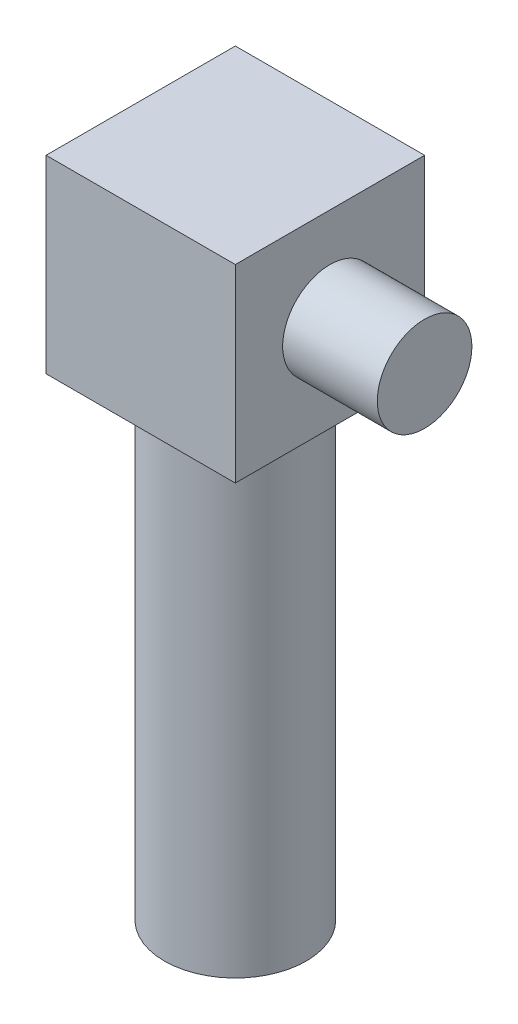
ISO-10303-21;
HEADER;
FILE_DESCRIPTION(('STEP AP214'),'2;1');
FILE_NAME('part.step','',(''),(''),'','','');
FILE_SCHEMA(('AUTOMOTIVE_DESIGN { 1 0 10303 214 1 1 1 1 }'));
ENDSEC;
DATA;
#1=APPLICATION_CONTEXT('core data for automotive mechanical design processes');
#2=APPLICATION_PROTOCOL_DEFINITION('international standard','automotive_design',2000,#1);
#3=PRODUCT_CONTEXT('',#1,'mechanical');
#4=PRODUCT('Part','Part','',(#3));
#5=PRODUCT_RELATED_PRODUCT_CATEGORY('part','',(#4));
#6=PRODUCT_DEFINITION_FORMATION('','',#4);
#7=PRODUCT_DEFINITION_CONTEXT('part definition',#1,'design');
#8=PRODUCT_DEFINITION('design','',#6,#7);
#9=PRODUCT_DEFINITION_SHAPE('','',#8);
#10=(LENGTH_UNIT() NAMED_UNIT(*) SI_UNIT(.MILLI.,.METRE.));
#11=(NAMED_UNIT(*) PLANE_ANGLE_UNIT() SI_UNIT($,.RADIAN.));
#12=(NAMED_UNIT(*) SI_UNIT($,.STERADIAN.) SOLID_ANGLE_UNIT());
#13=UNCERTAINTY_MEASURE_WITH_UNIT(LENGTH_MEASURE(1.E-05),#10,'distance_accuracy_value','');
#14=(GEOMETRIC_REPRESENTATION_CONTEXT(3) GLOBAL_UNCERTAINTY_ASSIGNED_CONTEXT((#13)) GLOBAL_UNIT_ASSIGNED_CONTEXT((#10,
#11,#12)) REPRESENTATION_CONTEXT('',''));
#15=CARTESIAN_POINT('',(0.,0.,0.));
#16=DIRECTION('',(0.,0.,1.));
#17=DIRECTION('',(1.,0.,0.));
#18=AXIS2_PLACEMENT_3D('',#15,#16,#17);
#19=CARTESIAN_POINT('',(0.,50.,0.));
#20=DIRECTION('',(0.,-1.,0.));
#21=DIRECTION('',(0.,0.,-1.));
#22=AXIS2_PLACEMENT_3D('',#19,#20,#21);
#23=CYLINDRICAL_SURFACE('',#22,5.);
#24=CARTESIAN_POINT('',(0.,50.,0.));
#25=DIRECTION('',(0.,1.,0.));
#26=DIRECTION('',(0.,0.,1.));
#27=AXIS2_PLACEMENT_3D('',#24,#25,#26);
#28=CIRCLE('',#27,5.);
#29=CARTESIAN_POINT('',(0.,50.,5.));
#30=VERTEX_POINT('',#29);
#31=EDGE_CURVE('E134',#30,#30,#28,.T.);
#32=ORIENTED_EDGE('',*,*,#31,.T.);
#33=EDGE_LOOP('',(#32));
#34=FACE_BOUND('',#33,.T.);
#35=CARTESIAN_POINT('',(0.,0.,0.));
#36=DIRECTION('',(0.,1.,0.));
#37=DIRECTION('',(0.,0.,1.));
#38=AXIS2_PLACEMENT_3D('',#35,#36,#37);
#39=CIRCLE('',#38,5.);
#40=CARTESIAN_POINT('',(0.,0.,5.));
#41=VERTEX_POINT('',#40);
#42=EDGE_CURVE('E137',#41,#41,#39,.T.);
#43=ORIENTED_EDGE('',*,*,#42,.F.);
#44=EDGE_LOOP('',(#43));
#45=FACE_BOUND('',#44,.T.);
#46=ADVANCED_FACE('F55',(#34,#45),#23,.F.);
#47=CARTESIAN_POINT('',(0.,50.,0.));
#48=DIRECTION('',(0.,-1.,0.));
#49=DIRECTION('',(0.,0.,-1.));
#50=AXIS2_PLACEMENT_3D('',#47,#48,#49);
#51=CYLINDRICAL_SURFACE('',#50,7.5);
#52=CARTESIAN_POINT('',(0.,50.,0.));
#53=DIRECTION('',(0.,1.,0.));
#54=DIRECTION('',(0.,0.,1.));
#55=AXIS2_PLACEMENT_3D('',#52,#53,#54);
#56=CIRCLE('',#55,7.5);
#57=CARTESIAN_POINT('',(0.,50.,7.5));
#58=VERTEX_POINT('',#57);
#59=EDGE_CURVE('E62',#58,#58,#56,.T.);
#60=ORIENTED_EDGE('',*,*,#59,.F.);
#61=EDGE_LOOP('',(#60));
#62=FACE_BOUND('',#61,.T.);
#63=CARTESIAN_POINT('',(0.,0.,0.));
#64=DIRECTION('',(0.,1.,0.));
#65=DIRECTION('',(0.,0.,1.));
#66=AXIS2_PLACEMENT_3D('',#63,#64,#65);
#67=CIRCLE('',#66,7.5);
#68=CARTESIAN_POINT('',(0.,0.,7.5));
#69=VERTEX_POINT('',#68);
#70=EDGE_CURVE('E54',#69,#69,#67,.T.);
#71=ORIENTED_EDGE('',*,*,#70,.T.);
#72=EDGE_LOOP('',(#71));
#73=FACE_BOUND('',#72,.T.);
#74=ADVANCED_FACE('F145',(#62,#73),#51,.T.);
#75=CARTESIAN_POINT('',(0.,0.,0.));
#76=DIRECTION('',(0.,1.,0.));
#77=DIRECTION('',(0.,0.,1.));
#78=AXIS2_PLACEMENT_3D('',#75,#76,#77);
#79=PLANE('',#78);
#80=ORIENTED_EDGE('',*,*,#42,.T.);
#81=EDGE_LOOP('',(#80));
#82=FACE_BOUND('',#81,.T.);
#83=ORIENTED_EDGE('',*,*,#70,.F.);
#84=EDGE_LOOP('',(#83));
#85=FACE_BOUND('',#84,.T.);
#86=ADVANCED_FACE('F148',(#82,#85),#79,.F.);
#87=CARTESIAN_POINT('',(0.,50.,0.));
#88=DIRECTION('',(0.,1.,0.));
#89=DIRECTION('',(0.,0.,1.));
#90=AXIS2_PLACEMENT_3D('',#87,#88,#89);
#91=PLANE('',#90);
#92=ORIENTED_EDGE('',*,*,#59,.T.);
#93=EDGE_LOOP('',(#92));
#94=FACE_BOUND('',#93,.T.);
#95=DIRECTION('',(1.,0.,0.));
#96=VECTOR('',#95,1.);
#97=CARTESIAN_POINT('',(0.,50.,10.));
#98=LINE('',#97,#96);
#99=CARTESIAN_POINT('',(-10.,50.,10.));
#100=VERTEX_POINT('',#99);
#101=CARTESIAN_POINT('',(10.,50.,10.));
#102=VERTEX_POINT('',#101);
#103=EDGE_CURVE('E122',#100,#102,#98,.T.);
#104=ORIENTED_EDGE('',*,*,#103,.F.);
#105=DIRECTION('',(0.,0.,-1.));
#106=VECTOR('',#105,1.);
#107=CARTESIAN_POINT('',(-10.,50.,0.));
#108=LINE('',#107,#106);
#109=CARTESIAN_POINT('',(-10.,50.,-10.));
#110=VERTEX_POINT('',#109);
#111=EDGE_CURVE('E130',#100,#110,#108,.T.);
#112=ORIENTED_EDGE('',*,*,#111,.T.);
#113=DIRECTION('',(1.,0.,0.));
#114=VECTOR('',#113,1.);
#115=CARTESIAN_POINT('',(0.,50.,-10.));
#116=LINE('',#115,#114);
#117=CARTESIAN_POINT('',(10.,50.,-10.));
#118=VERTEX_POINT('',#117);
#119=EDGE_CURVE('E123',#110,#118,#116,.T.);
#120=ORIENTED_EDGE('',*,*,#119,.T.);
#121=DIRECTION('',(0.,0.,-1.));
#122=VECTOR('',#121,1.);
#123=CARTESIAN_POINT('',(10.,50.,0.));
#124=LINE('',#123,#122);
#125=EDGE_CURVE('E109',#102,#118,#124,.T.);
#126=ORIENTED_EDGE('',*,*,#125,.F.);
#127=EDGE_LOOP('',(#104,#112,#120,#126));
#128=FACE_BOUND('',#127,.T.);
#129=ADVANCED_FACE('F146',(#94,#128),#91,.F.);
#130=CARTESIAN_POINT('',(0.,70.,0.));
#131=DIRECTION('',(0.,1.,0.));
#132=DIRECTION('',(0.,0.,1.));
#133=AXIS2_PLACEMENT_3D('',#130,#131,#132);
#134=PLANE('',#133);
#135=DIRECTION('',(1.,0.,0.));
#136=VECTOR('',#135,1.);
#137=CARTESIAN_POINT('',(0.,70.,10.));
#138=LINE('',#137,#136);
#139=CARTESIAN_POINT('',(-10.,70.,10.));
#140=VERTEX_POINT('',#139);
#141=CARTESIAN_POINT('',(10.,70.,10.));
#142=VERTEX_POINT('',#141);
#143=EDGE_CURVE('E102',#140,#142,#138,.T.);
#144=ORIENTED_EDGE('',*,*,#143,.T.);
#145=DIRECTION('',(0.,0.,-1.));
#146=VECTOR('',#145,1.);
#147=CARTESIAN_POINT('',(10.,70.,0.));
#148=LINE('',#147,#146);
#149=CARTESIAN_POINT('',(10.,70.,-10.));
#150=VERTEX_POINT('',#149);
#151=EDGE_CURVE('E96',#142,#150,#148,.T.);
#152=ORIENTED_EDGE('',*,*,#151,.T.);
#153=DIRECTION('',(1.,0.,0.));
#154=VECTOR('',#153,1.);
#155=CARTESIAN_POINT('',(0.,70.,-10.));
#156=LINE('',#155,#154);
#157=CARTESIAN_POINT('',(-10.,70.,-10.));
#158=VERTEX_POINT('',#157);
#159=EDGE_CURVE('E103',#158,#150,#156,.T.);
#160=ORIENTED_EDGE('',*,*,#159,.F.);
#161=DIRECTION('',(0.,0.,-1.));
#162=VECTOR('',#161,1.);
#163=CARTESIAN_POINT('',(-10.,70.,0.));
#164=LINE('',#163,#162);
#165=EDGE_CURVE('E117',#140,#158,#164,.T.);
#166=ORIENTED_EDGE('',*,*,#165,.F.);
#167=EDGE_LOOP('',(#144,#152,#160,#166));
#168=FACE_BOUND('',#167,.T.);
#169=ADVANCED_FACE('F99',(#168),#134,.T.);
#170=CARTESIAN_POINT('',(-10.,70.,0.));
#171=DIRECTION('',(-1.,0.,0.));
#172=DIRECTION('',(0.,0.,1.));
#173=AXIS2_PLACEMENT_3D('',#170,#171,#172);
#174=PLANE('',#173);
#175=ORIENTED_EDGE('',*,*,#111,.F.);
#176=DIRECTION('',(0.,-1.,0.));
#177=VECTOR('',#176,1.);
#178=CARTESIAN_POINT('',(-10.,70.,10.));
#179=LINE('',#178,#177);
#180=EDGE_CURVE('E68',#140,#100,#179,.T.);
#181=ORIENTED_EDGE('',*,*,#180,.F.);
#182=ORIENTED_EDGE('',*,*,#165,.T.);
#183=DIRECTION('',(0.,-1.,0.));
#184=VECTOR('',#183,1.);
#185=CARTESIAN_POINT('',(-10.,70.,-10.));
#186=LINE('',#185,#184);
#187=EDGE_CURVE('E81',#158,#110,#186,.T.);
#188=ORIENTED_EDGE('',*,*,#187,.T.);
#189=EDGE_LOOP('',(#175,#181,#182,#188));
#190=FACE_BOUND('',#189,.T.);
#191=ADVANCED_FACE('F179',(#190),#174,.T.);
#192=CARTESIAN_POINT('',(0.,70.,-10.));
#193=DIRECTION('',(0.,0.,-1.));
#194=DIRECTION('',(-1.,0.,0.));
#195=AXIS2_PLACEMENT_3D('',#192,#193,#194);
#196=PLANE('',#195);
#197=ORIENTED_EDGE('',*,*,#119,.F.);
#198=ORIENTED_EDGE('',*,*,#187,.F.);
#199=ORIENTED_EDGE('',*,*,#159,.T.);
#200=DIRECTION('',(0.,-1.,0.));
#201=VECTOR('',#200,1.);
#202=CARTESIAN_POINT('',(10.,70.,-10.));
#203=LINE('',#202,#201);
#204=EDGE_CURVE('E107',#150,#118,#203,.T.);
#205=ORIENTED_EDGE('',*,*,#204,.T.);
#206=EDGE_LOOP('',(#197,#198,#199,#205));
#207=FACE_BOUND('',#206,.T.);
#208=ADVANCED_FACE('F113',(#207),#196,.T.);
#209=CARTESIAN_POINT('',(10.,70.,0.));
#210=DIRECTION('',(-1.,0.,0.));
#211=DIRECTION('',(0.,0.,1.));
#212=AXIS2_PLACEMENT_3D('',#209,#210,#211);
#213=PLANE('',#212);
#214=CARTESIAN_POINT('',(10.,60.,0.));
#215=DIRECTION('',(1.,0.,0.));
#216=DIRECTION('',(0.,0.,-1.));
#217=AXIS2_PLACEMENT_3D('',#214,#215,#216);
#218=CIRCLE('',#217,5.);
#219=CARTESIAN_POINT('',(10.,60.,-5.));
#220=VERTEX_POINT('',#219);
#221=EDGE_CURVE('E11',#220,#220,#218,.T.);
#222=ORIENTED_EDGE('',*,*,#221,.F.);
#223=EDGE_LOOP('',(#222));
#224=FACE_BOUND('',#223,.T.);
#225=ORIENTED_EDGE('',*,*,#125,.T.);
#226=ORIENTED_EDGE('',*,*,#204,.F.);
#227=ORIENTED_EDGE('',*,*,#151,.F.);
#228=DIRECTION('',(0.,-1.,0.));
#229=VECTOR('',#228,1.);
#230=CARTESIAN_POINT('',(10.,70.,10.));
#231=LINE('',#230,#229);
#232=EDGE_CURVE('E114',#142,#102,#231,.T.);
#233=ORIENTED_EDGE('',*,*,#232,.T.);
#234=EDGE_LOOP('',(#225,#226,#227,#233));
#235=FACE_BOUND('',#234,.T.);
#236=ADVANCED_FACE('F108',(#224,#235),#213,.F.);
#237=CARTESIAN_POINT('',(0.,70.,10.));
#238=DIRECTION('',(0.,0.,-1.));
#239=DIRECTION('',(-1.,0.,0.));
#240=AXIS2_PLACEMENT_3D('',#237,#238,#239);
#241=PLANE('',#240);
#242=ORIENTED_EDGE('',*,*,#103,.T.);
#243=ORIENTED_EDGE('',*,*,#232,.F.);
#244=ORIENTED_EDGE('',*,*,#143,.F.);
#245=ORIENTED_EDGE('',*,*,#180,.T.);
#246=EDGE_LOOP('',(#242,#243,#244,#245));
#247=FACE_BOUND('',#246,.T.);
#248=ADVANCED_FACE('F166',(#247),#241,.F.);
#249=ORIENTED_EDGE('',*,*,#31,.F.);
#250=EDGE_LOOP('',(#249));
#251=FACE_BOUND('',#250,.T.);
#252=ADVANCED_FACE('F156',(#251),#91,.F.);
#253=CARTESIAN_POINT('',(20.,60.,0.));
#254=DIRECTION('',(-1.,0.,0.));
#255=DIRECTION('',(0.,0.,1.));
#256=AXIS2_PLACEMENT_3D('',#253,#254,#255);
#257=CYLINDRICAL_SURFACE('',#256,5.);
#258=CARTESIAN_POINT('',(20.,60.,0.));
#259=DIRECTION('',(1.,0.,0.));
#260=DIRECTION('',(0.,0.,-1.));
#261=AXIS2_PLACEMENT_3D('',#258,#259,#260);
#262=CIRCLE('',#261,5.);
#263=CARTESIAN_POINT('',(20.,60.,-5.));
#264=VERTEX_POINT('',#263);
#265=EDGE_CURVE('E124',#264,#264,#262,.T.);
#266=ORIENTED_EDGE('',*,*,#265,.F.);
#267=EDGE_LOOP('',(#266));
#268=FACE_BOUND('',#267,.T.);
#269=ORIENTED_EDGE('',*,*,#221,.T.);
#270=EDGE_LOOP('',(#269));
#271=FACE_BOUND('',#270,.T.);
#272=ADVANCED_FACE('F169',(#268,#271),#257,.T.);
#273=CARTESIAN_POINT('',(20.,0.,0.));
#274=DIRECTION('',(1.,0.,0.));
#275=DIRECTION('',(0.,0.,-1.));
#276=AXIS2_PLACEMENT_3D('',#273,#274,#275);
#277=PLANE('',#276);
#278=ORIENTED_EDGE('',*,*,#265,.T.);
#279=EDGE_LOOP('',(#278));
#280=FACE_BOUND('',#279,.T.);
#281=ADVANCED_FACE('F174',(#280),#277,.T.);
#282=CLOSED_SHELL('',(#46,#74,#86,#129,#169,#191,#208,#236,#248,#252,#272,#281));
#283=MANIFOLD_SOLID_BREP('B2',#282);
#284=ADVANCED_BREP_SHAPE_REPRESENTATION('',(#18,#283),#14);
#285=SHAPE_DEFINITION_REPRESENTATION(#9,#284);
ENDSEC;
END-ISO-10303-21;
